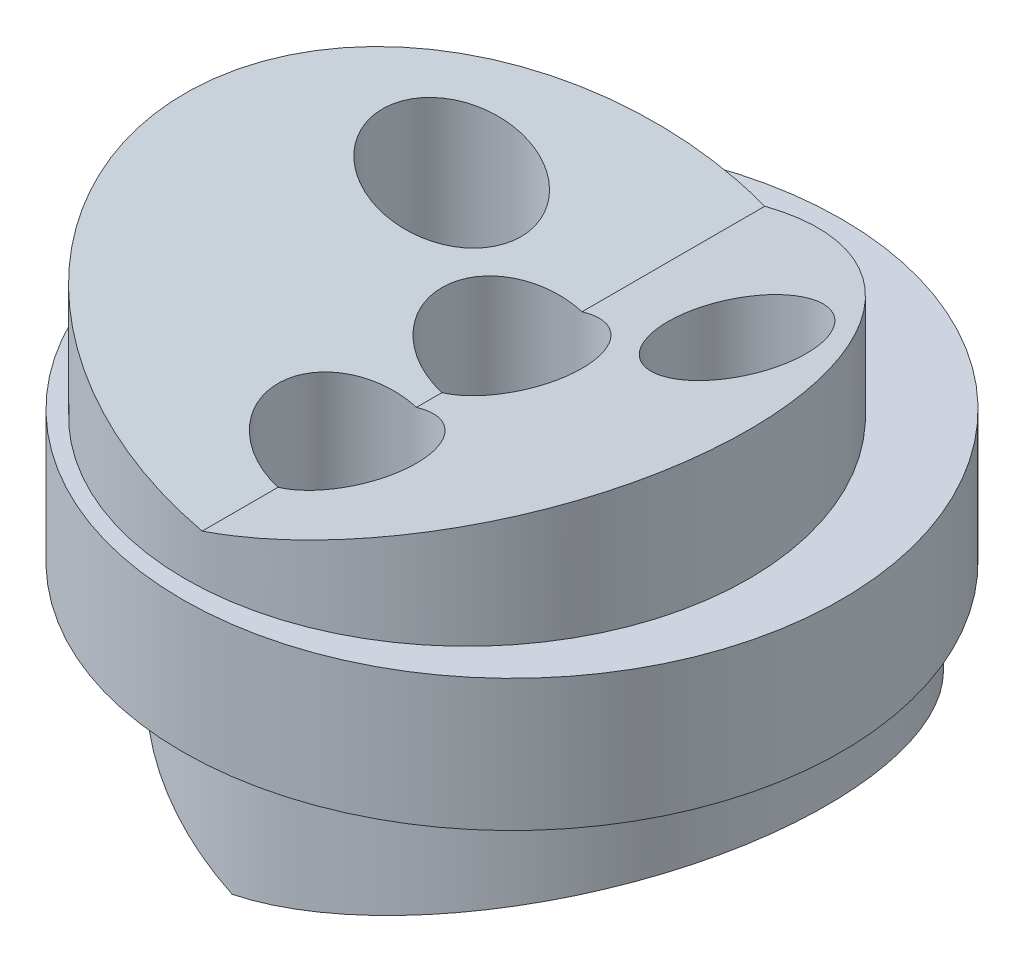
ISO-10303-21;
HEADER;
FILE_DESCRIPTION(('STEP AP214'),'2;1');
FILE_NAME('part.step','',(''),(''),'','','');
FILE_SCHEMA(('AUTOMOTIVE_DESIGN { 1 0 10303 214 1 1 1 1 }'));
ENDSEC;
DATA;
#1=APPLICATION_CONTEXT('core data for automotive mechanical design processes');
#2=APPLICATION_PROTOCOL_DEFINITION('international standard','automotive_design',2000,#1);
#3=PRODUCT_CONTEXT('',#1,'mechanical');
#4=PRODUCT('Part','Part','',(#3));
#5=PRODUCT_RELATED_PRODUCT_CATEGORY('part','',(#4));
#6=PRODUCT_DEFINITION_FORMATION('','',#4);
#7=PRODUCT_DEFINITION_CONTEXT('part definition',#1,'design');
#8=PRODUCT_DEFINITION('design','',#6,#7);
#9=PRODUCT_DEFINITION_SHAPE('','',#8);
#10=(LENGTH_UNIT() NAMED_UNIT(*) SI_UNIT(.MILLI.,.METRE.));
#11=(NAMED_UNIT(*) PLANE_ANGLE_UNIT() SI_UNIT($,.RADIAN.));
#12=(NAMED_UNIT(*) SI_UNIT($,.STERADIAN.) SOLID_ANGLE_UNIT());
#13=UNCERTAINTY_MEASURE_WITH_UNIT(LENGTH_MEASURE(1.E-05),#10,'distance_accuracy_value','');
#14=(GEOMETRIC_REPRESENTATION_CONTEXT(3) GLOBAL_UNCERTAINTY_ASSIGNED_CONTEXT((#13)) GLOBAL_UNIT_ASSIGNED_CONTEXT((#10,
#11,#12)) REPRESENTATION_CONTEXT('',''));
#15=CARTESIAN_POINT('',(0.,0.,0.));
#16=DIRECTION('',(0.,0.,1.));
#17=DIRECTION('',(1.,0.,0.));
#18=AXIS2_PLACEMENT_3D('',#15,#16,#17);
#19=CARTESIAN_POINT('',(-10.,15.4999999999969,-14.01));
#20=DIRECTION('',(-0.287347885566345,-0.957826285221151,0.));
#21=DIRECTION('',(0.957826285221151,-0.287347885566345,0.));
#22=AXIS2_PLACEMENT_3D('',#19,#20,#21);
#23=PLANE('',#22);
#24=CARTESIAN_POINT('',(-4.33012701892218,13.7990381056736,-2.50000000000002));
#25=DIRECTION('',(-0.287347885566345,-0.957826285221151,0.));
#26=DIRECTION('',(0.957826285221151,-0.287347885566345,0.));
#27=AXIS2_PLACEMENT_3D('',#24,#25,#26);
#28=ELLIPSE('',#27,2.19246436687122,2.1);
#29=CARTESIAN_POINT('',(-2.23012701892218,13.1690381056736,-2.50000000000002));
#30=VERTEX_POINT('',#29);
#31=EDGE_CURVE('E117',#30,#30,#28,.T.);
#32=ORIENTED_EDGE('',*,*,#31,.T.);
#33=EDGE_LOOP('',(#32));
#34=FACE_BOUND('',#33,.T.);
#35=DIRECTION('',(0.,0.,1.));
#36=VECTOR('',#35,1.);
#37=CARTESIAN_POINT('',(0.,12.4999999999969,-14.01));
#38=LINE('',#37,#36);
#39=CARTESIAN_POINT('',(0.,12.4999999999969,7.09999999999999));
#40=VERTEX_POINT('',#39);
#41=CARTESIAN_POINT('',(0.,12.4999999999969,9.40139299985199));
#42=VERTEX_POINT('',#41);
#43=EDGE_CURVE('E106',#40,#42,#38,.T.);
#44=ORIENTED_EDGE('',*,*,#43,.F.);
#45=CARTESIAN_POINT('',(0.,12.4999999999969,5.));
#46=DIRECTION('',(-0.287347885566345,-0.957826285221151,0.));
#47=DIRECTION('',(0.957826285221151,-0.287347885566345,0.));
#48=AXIS2_PLACEMENT_3D('',#45,#46,#47);
#49=ELLIPSE('',#48,2.19246436687122,2.1);
#50=CARTESIAN_POINT('',(0.,12.4999999999969,2.89999999999999));
#51=VERTEX_POINT('',#50);
#52=EDGE_CURVE('E94',#40,#51,#49,.T.);
#53=ORIENTED_EDGE('',*,*,#52,.T.);
#54=CARTESIAN_POINT('',(0.,12.4999999999969,2.125));
#55=VERTEX_POINT('',#54);
#56=EDGE_CURVE('E112',#55,#51,#38,.T.);
#57=ORIENTED_EDGE('',*,*,#56,.F.);
#58=CARTESIAN_POINT('',(0.,12.4999999999969,0.));
#59=DIRECTION('',(-0.287347885566345,-0.957826285221151,0.));
#60=DIRECTION('',(0.957826285221151,-0.287347885566345,0.));
#61=AXIS2_PLACEMENT_3D('',#58,#59,#60);
#62=ELLIPSE('',#61,2.21856513314349,2.125);
#63=CARTESIAN_POINT('',(0.,12.4999999999969,-2.125));
#64=VERTEX_POINT('',#63);
#65=EDGE_CURVE('E142',#64,#55,#62,.F.);
#66=ORIENTED_EDGE('',*,*,#65,.F.);
#67=CARTESIAN_POINT('',(0.,12.4999999999969,-7.66934219228312));
#68=VERTEX_POINT('',#67);
#69=EDGE_CURVE('E103',#68,#64,#38,.T.);
#70=ORIENTED_EDGE('',*,*,#69,.F.);
#71=CARTESIAN_POINT('',(-0.500000000000004,12.6499999999969,0.866025403784436));
#72=DIRECTION('',(-0.287347885566345,-0.957826285221151,0.));
#73=DIRECTION('',(0.957826285221151,-0.287347885566345,0.));
#74=AXIS2_PLACEMENT_3D('',#71,#72,#73);
#75=ELLIPSE('',#74,8.92646206511852,8.55);
#76=EDGE_CURVE('E108',#42,#68,#75,.T.);
#77=ORIENTED_EDGE('',*,*,#76,.F.);
#78=EDGE_LOOP('',(#44,#53,#57,#66,#70,#77));
#79=FACE_BOUND('',#78,.T.);
#80=ADVANCED_FACE('F41',(#34,#79),#23,.F.);
#81=CARTESIAN_POINT('',(10.,15.4999999999969,-14.01));
#82=DIRECTION('',(0.287347885566345,-0.957826285221151,0.));
#83=DIRECTION('',(0.957826285221151,0.287347885566345,0.));
#84=AXIS2_PLACEMENT_3D('',#81,#82,#83);
#85=PLANE('',#84);
#86=CARTESIAN_POINT('',(4.33012701892218,13.7990381056736,-2.50000000000002));
#87=DIRECTION('',(0.287347885566345,-0.957826285221151,0.));
#88=DIRECTION('',(-0.957826285221151,-0.287347885566345,0.));
#89=AXIS2_PLACEMENT_3D('',#86,#87,#88);
#90=ELLIPSE('',#89,2.19246436687122,2.1);
#91=CARTESIAN_POINT('',(2.23012701892218,13.1690381056736,-2.50000000000002));
#92=VERTEX_POINT('',#91);
#93=EDGE_CURVE('E120',#92,#92,#90,.T.);
#94=ORIENTED_EDGE('',*,*,#93,.T.);
#95=EDGE_LOOP('',(#94));
#96=FACE_BOUND('',#95,.T.);
#97=ORIENTED_EDGE('',*,*,#69,.T.);
#98=CARTESIAN_POINT('',(0.,12.4999999999969,0.));
#99=DIRECTION('',(0.287347885566345,-0.957826285221151,0.));
#100=DIRECTION('',(-0.957826285221151,-0.287347885566345,0.));
#101=AXIS2_PLACEMENT_3D('',#98,#99,#100);
#102=ELLIPSE('',#101,2.21856513314349,2.125);
#103=EDGE_CURVE('E139',#55,#64,#102,.F.);
#104=ORIENTED_EDGE('',*,*,#103,.F.);
#105=ORIENTED_EDGE('',*,*,#56,.T.);
#106=CARTESIAN_POINT('',(0.,12.4999999999969,5.));
#107=DIRECTION('',(0.287347885566345,-0.957826285221151,0.));
#108=DIRECTION('',(-0.957826285221151,-0.287347885566345,0.));
#109=AXIS2_PLACEMENT_3D('',#106,#107,#108);
#110=ELLIPSE('',#109,2.19246436687122,2.1);
#111=EDGE_CURVE('E99',#51,#40,#110,.T.);
#112=ORIENTED_EDGE('',*,*,#111,.T.);
#113=ORIENTED_EDGE('',*,*,#43,.T.);
#114=CARTESIAN_POINT('',(-0.500000000000004,12.3499999999969,0.866025403784436));
#115=DIRECTION('',(0.287347885566345,-0.957826285221151,0.));
#116=DIRECTION('',(-0.957826285221151,-0.287347885566345,0.));
#117=AXIS2_PLACEMENT_3D('',#114,#115,#116);
#118=ELLIPSE('',#117,8.92646206511852,8.55);
#119=EDGE_CURVE('E126',#68,#42,#118,.T.);
#120=ORIENTED_EDGE('',*,*,#119,.F.);
#121=EDGE_LOOP('',(#97,#104,#105,#112,#113,#120));
#122=FACE_BOUND('',#121,.T.);
#123=ADVANCED_FACE('F115',(#96,#122),#85,.F.);
#124=CARTESIAN_POINT('',(-10.,5.49999999999693,-14.01));
#125=DIRECTION('',(-0.287347885566345,-0.957826285221151,0.));
#126=DIRECTION('',(0.957826285221151,-0.287347885566345,0.));
#127=AXIS2_PLACEMENT_3D('',#124,#125,#126);
#128=PLANE('',#127);
#129=DIRECTION('',(0.,0.,1.));
#130=VECTOR('',#129,1.);
#131=CARTESIAN_POINT('',(0.,2.49999999999693,-14.01));
#132=LINE('',#131,#130);
#133=CARTESIAN_POINT('',(0.,2.49999999999693,7.09999999999999));
#134=VERTEX_POINT('',#133);
#135=CARTESIAN_POINT('',(0.,2.49999999999693,8.49131909658328));
#136=VERTEX_POINT('',#135);
#137=EDGE_CURVE('E11',#134,#136,#132,.T.);
#138=ORIENTED_EDGE('',*,*,#137,.T.);
#139=CARTESIAN_POINT('',(1.,2.19999999999693,0.));
#140=DIRECTION('',(-0.287347885566345,-0.957826285221151,0.));
#141=DIRECTION('',(0.957826285221151,-0.287347885566345,0.));
#142=AXIS2_PLACEMENT_3D('',#139,#140,#141);
#143=ELLIPSE('',#142,8.92646206511852,8.55);
#144=CARTESIAN_POINT('',(0.,2.49999999999693,-8.49131909658329));
#145=VERTEX_POINT('',#144);
#146=EDGE_CURVE('E127',#136,#145,#143,.T.);
#147=ORIENTED_EDGE('',*,*,#146,.T.);
#148=CARTESIAN_POINT('',(0.,2.49999999999693,-2.125));
#149=VERTEX_POINT('',#148);
#150=EDGE_CURVE('E52',#145,#149,#132,.T.);
#151=ORIENTED_EDGE('',*,*,#150,.T.);
#152=CARTESIAN_POINT('',(0.,2.49999999999693,0.));
#153=DIRECTION('',(-0.287347885566345,-0.957826285221151,0.));
#154=DIRECTION('',(0.957826285221151,-0.287347885566345,0.));
#155=AXIS2_PLACEMENT_3D('',#152,#153,#154);
#156=ELLIPSE('',#155,2.21856513314349,2.125);
#157=CARTESIAN_POINT('',(0.,2.49999999999693,2.125));
#158=VERTEX_POINT('',#157);
#159=EDGE_CURVE('E45',#149,#158,#156,.F.);
#160=ORIENTED_EDGE('',*,*,#159,.T.);
#161=CARTESIAN_POINT('',(0.,2.49999999999693,2.89999999999999));
#162=VERTEX_POINT('',#161);
#163=EDGE_CURVE('E50',#158,#162,#132,.T.);
#164=ORIENTED_EDGE('',*,*,#163,.T.);
#165=CARTESIAN_POINT('',(0.,2.49999999999693,5.));
#166=DIRECTION('',(-0.287347885566345,-0.957826285221151,0.));
#167=DIRECTION('',(0.957826285221151,-0.287347885566345,0.));
#168=AXIS2_PLACEMENT_3D('',#165,#166,#167);
#169=ELLIPSE('',#168,2.19246436687122,2.1);
#170=EDGE_CURVE('E157',#134,#162,#169,.T.);
#171=ORIENTED_EDGE('',*,*,#170,.F.);
#172=EDGE_LOOP('',(#138,#147,#151,#160,#164,#171));
#173=FACE_BOUND('',#172,.T.);
#174=CARTESIAN_POINT('',(-4.33012701892218,3.79903810567358,-2.50000000000002));
#175=DIRECTION('',(-0.287347885566345,-0.957826285221151,0.));
#176=DIRECTION('',(0.957826285221151,-0.287347885566345,0.));
#177=AXIS2_PLACEMENT_3D('',#174,#175,#176);
#178=ELLIPSE('',#177,2.19246436687122,2.1);
#179=CARTESIAN_POINT('',(-2.23012701892218,3.16903810567358,-2.50000000000002));
#180=VERTEX_POINT('',#179);
#181=EDGE_CURVE('E161',#180,#180,#178,.T.);
#182=ORIENTED_EDGE('',*,*,#181,.F.);
#183=EDGE_LOOP('',(#182));
#184=FACE_BOUND('',#183,.T.);
#185=ADVANCED_FACE('F172',(#173,#184),#128,.T.);
#186=CARTESIAN_POINT('',(10.,5.49999999999693,-14.01));
#187=DIRECTION('',(0.287347885566345,-0.957826285221151,0.));
#188=DIRECTION('',(0.957826285221151,0.287347885566345,0.));
#189=AXIS2_PLACEMENT_3D('',#186,#187,#188);
#190=PLANE('',#189);
#191=ORIENTED_EDGE('',*,*,#150,.F.);
#192=CARTESIAN_POINT('',(1.,2.79999999999693,0.));
#193=DIRECTION('',(0.287347885566345,-0.957826285221151,0.));
#194=DIRECTION('',(-0.957826285221151,-0.287347885566345,0.));
#195=AXIS2_PLACEMENT_3D('',#192,#193,#194);
#196=ELLIPSE('',#195,8.92646206511852,8.55);
#197=EDGE_CURVE('E124',#145,#136,#196,.T.);
#198=ORIENTED_EDGE('',*,*,#197,.T.);
#199=ORIENTED_EDGE('',*,*,#137,.F.);
#200=CARTESIAN_POINT('',(0.,2.49999999999692,5.));
#201=DIRECTION('',(0.287347885566345,-0.957826285221151,0.));
#202=DIRECTION('',(-0.957826285221151,-0.287347885566345,0.));
#203=AXIS2_PLACEMENT_3D('',#200,#201,#202);
#204=ELLIPSE('',#203,2.19246436687122,2.1);
#205=EDGE_CURVE('E159',#162,#134,#204,.T.);
#206=ORIENTED_EDGE('',*,*,#205,.F.);
#207=ORIENTED_EDGE('',*,*,#163,.F.);
#208=CARTESIAN_POINT('',(0.,2.49999999999692,0.));
#209=DIRECTION('',(0.287347885566345,-0.957826285221151,0.));
#210=DIRECTION('',(-0.957826285221151,-0.287347885566345,0.));
#211=AXIS2_PLACEMENT_3D('',#208,#209,#210);
#212=ELLIPSE('',#211,2.21856513314349,2.125);
#213=EDGE_CURVE('E129',#158,#149,#212,.F.);
#214=ORIENTED_EDGE('',*,*,#213,.T.);
#215=EDGE_LOOP('',(#191,#198,#199,#206,#207,#214));
#216=FACE_BOUND('',#215,.T.);
#217=CARTESIAN_POINT('',(4.33012701892218,3.79903810567358,-2.50000000000002));
#218=DIRECTION('',(0.287347885566345,-0.957826285221151,0.));
#219=DIRECTION('',(-0.957826285221151,-0.287347885566345,0.));
#220=AXIS2_PLACEMENT_3D('',#217,#218,#219);
#221=ELLIPSE('',#220,2.19246436687122,2.1);
#222=CARTESIAN_POINT('',(2.23012701892218,3.16903810567358,-2.50000000000002));
#223=VERTEX_POINT('',#222);
#224=EDGE_CURVE('E144',#223,#223,#221,.T.);
#225=ORIENTED_EDGE('',*,*,#224,.F.);
#226=EDGE_LOOP('',(#225));
#227=FACE_BOUND('',#226,.T.);
#228=ADVANCED_FACE('F170',(#216,#227),#190,.T.);
#229=CARTESIAN_POINT('',(0.,31.5,5.));
#230=DIRECTION('',(0.,-1.,0.));
#231=DIRECTION('',(0.,0.,-1.));
#232=AXIS2_PLACEMENT_3D('',#229,#230,#231);
#233=CYLINDRICAL_SURFACE('',#232,2.1);
#234=ORIENTED_EDGE('',*,*,#111,.F.);
#235=ORIENTED_EDGE('',*,*,#52,.F.);
#236=EDGE_LOOP('',(#234,#235));
#237=FACE_BOUND('',#236,.T.);
#238=ORIENTED_EDGE('',*,*,#170,.T.);
#239=ORIENTED_EDGE('',*,*,#205,.T.);
#240=EDGE_LOOP('',(#238,#239));
#241=FACE_BOUND('',#240,.T.);
#242=ADVANCED_FACE('F96',(#237,#241),#233,.F.);
#243=CARTESIAN_POINT('',(-4.33012701892218,31.5,-2.50000000000002));
#244=DIRECTION('',(0.,-1.,0.));
#245=DIRECTION('',(0.,0.,-1.));
#246=AXIS2_PLACEMENT_3D('',#243,#244,#245);
#247=CYLINDRICAL_SURFACE('',#246,2.1);
#248=ORIENTED_EDGE('',*,*,#31,.F.);
#249=EDGE_LOOP('',(#248));
#250=FACE_BOUND('',#249,.T.);
#251=ORIENTED_EDGE('',*,*,#181,.T.);
#252=EDGE_LOOP('',(#251));
#253=FACE_BOUND('',#252,.T.);
#254=ADVANCED_FACE('F179',(#250,#253),#247,.F.);
#255=CARTESIAN_POINT('',(4.33012701892218,31.5,-2.50000000000002));
#256=DIRECTION('',(0.,-1.,0.));
#257=DIRECTION('',(0.,0.,-1.));
#258=AXIS2_PLACEMENT_3D('',#255,#256,#257);
#259=CYLINDRICAL_SURFACE('',#258,2.1);
#260=ORIENTED_EDGE('',*,*,#93,.F.);
#261=EDGE_LOOP('',(#260));
#262=FACE_BOUND('',#261,.T.);
#263=ORIENTED_EDGE('',*,*,#224,.T.);
#264=EDGE_LOOP('',(#263));
#265=FACE_BOUND('',#264,.T.);
#266=ADVANCED_FACE('F168',(#262,#265),#259,.F.);
#267=CARTESIAN_POINT('',(0.,30.75,0.));
#268=DIRECTION('',(0.,-1.,0.));
#269=DIRECTION('',(0.,0.,-1.));
#270=AXIS2_PLACEMENT_3D('',#267,#268,#269);
#271=CYLINDRICAL_SURFACE('',#270,2.125);
#272=ORIENTED_EDGE('',*,*,#65,.T.);
#273=ORIENTED_EDGE('',*,*,#103,.T.);
#274=EDGE_LOOP('',(#272,#273));
#275=FACE_BOUND('',#274,.T.);
#276=ORIENTED_EDGE('',*,*,#213,.F.);
#277=ORIENTED_EDGE('',*,*,#159,.F.);
#278=EDGE_LOOP('',(#276,#277));
#279=FACE_BOUND('',#278,.T.);
#280=ADVANCED_FACE('F198',(#275,#279),#271,.F.);
#281=CARTESIAN_POINT('',(0.,39.2842712474619,0.));
#282=DIRECTION('',(0.,-1.,0.));
#283=DIRECTION('',(0.,0.,-1.));
#284=AXIS2_PLACEMENT_3D('',#281,#282,#283);
#285=CYLINDRICAL_SURFACE('',#284,10.);
#286=CARTESIAN_POINT('',(0.,7.,0.));
#287=DIRECTION('',(0.,1.,0.));
#288=DIRECTION('',(0.,0.,1.));
#289=AXIS2_PLACEMENT_3D('',#286,#287,#288);
#290=CIRCLE('',#289,10.);
#291=CARTESIAN_POINT('',(0.,7.,10.));
#292=VERTEX_POINT('',#291);
#293=EDGE_CURVE('E145',#292,#292,#290,.T.);
#294=ORIENTED_EDGE('',*,*,#293,.T.);
#295=EDGE_LOOP('',(#294));
#296=FACE_BOUND('',#295,.T.);
#297=CARTESIAN_POINT('',(0.,11.,0.));
#298=DIRECTION('',(0.,1.,0.));
#299=DIRECTION('',(0.,0.,1.));
#300=AXIS2_PLACEMENT_3D('',#297,#298,#299);
#301=CIRCLE('',#300,10.);
#302=CARTESIAN_POINT('',(0.,11.,10.));
#303=VERTEX_POINT('',#302);
#304=EDGE_CURVE('E148',#303,#303,#301,.T.);
#305=ORIENTED_EDGE('',*,*,#304,.F.);
#306=EDGE_LOOP('',(#305));
#307=FACE_BOUND('',#306,.T.);
#308=ADVANCED_FACE('F194',(#296,#307),#285,.T.);
#309=CARTESIAN_POINT('',(0.499999999999998,7.,0.));
#310=DIRECTION('',(0.,1.,0.));
#311=DIRECTION('',(0.,0.,1.));
#312=AXIS2_PLACEMENT_3D('',#309,#310,#311);
#313=PLANE('',#312);
#314=CARTESIAN_POINT('',(1.,7.,0.));
#315=DIRECTION('',(0.,1.,0.));
#316=DIRECTION('',(0.,0.,1.));
#317=AXIS2_PLACEMENT_3D('',#314,#315,#316);
#318=CIRCLE('',#317,8.55);
#319=CARTESIAN_POINT('',(1.,7.,8.55));
#320=VERTEX_POINT('',#319);
#321=EDGE_CURVE('E154',#320,#320,#318,.T.);
#322=ORIENTED_EDGE('',*,*,#321,.T.);
#323=EDGE_LOOP('',(#322));
#324=FACE_BOUND('',#323,.T.);
#325=ORIENTED_EDGE('',*,*,#293,.F.);
#326=EDGE_LOOP('',(#325));
#327=FACE_BOUND('',#326,.T.);
#328=ADVANCED_FACE('F197',(#324,#327),#313,.F.);
#329=CARTESIAN_POINT('',(1.,7.,0.));
#330=DIRECTION('',(0.,-1.,0.));
#331=DIRECTION('',(0.,0.,-1.));
#332=AXIS2_PLACEMENT_3D('',#329,#330,#331);
#333=CYLINDRICAL_SURFACE('',#332,8.55);
#334=ORIENTED_EDGE('',*,*,#321,.F.);
#335=EDGE_LOOP('',(#334));
#336=FACE_BOUND('',#335,.T.);
#337=ORIENTED_EDGE('',*,*,#197,.F.);
#338=ORIENTED_EDGE('',*,*,#146,.F.);
#339=EDGE_LOOP('',(#337,#338));
#340=FACE_BOUND('',#339,.T.);
#341=ADVANCED_FACE('F43',(#336,#340),#333,.T.);
#342=CARTESIAN_POINT('',(0.249999999999996,11.,0.433012701892218));
#343=DIRECTION('',(0.,1.,0.));
#344=DIRECTION('',(0.,0.,1.));
#345=AXIS2_PLACEMENT_3D('',#342,#343,#344);
#346=PLANE('',#345);
#347=CARTESIAN_POINT('',(-0.500000000000004,11.,0.866025403784436));
#348=DIRECTION('',(0.,1.,0.));
#349=DIRECTION('',(0.,0.,1.));
#350=AXIS2_PLACEMENT_3D('',#347,#348,#349);
#351=CIRCLE('',#350,8.55);
#352=CARTESIAN_POINT('',(-0.500000000000004,11.,9.41602540378444));
#353=VERTEX_POINT('',#352);
#354=EDGE_CURVE('E151',#353,#353,#351,.T.);
#355=ORIENTED_EDGE('',*,*,#354,.F.);
#356=EDGE_LOOP('',(#355));
#357=FACE_BOUND('',#356,.T.);
#358=ORIENTED_EDGE('',*,*,#304,.T.);
#359=EDGE_LOOP('',(#358));
#360=FACE_BOUND('',#359,.T.);
#361=ADVANCED_FACE('F183',(#357,#360),#346,.T.);
#362=CARTESIAN_POINT('',(-0.500000000000004,18.,0.866025403784436));
#363=DIRECTION('',(0.,-1.,0.));
#364=DIRECTION('',(0.,0.,-1.));
#365=AXIS2_PLACEMENT_3D('',#362,#363,#364);
#366=CYLINDRICAL_SURFACE('',#365,8.55);
#367=ORIENTED_EDGE('',*,*,#76,.T.);
#368=ORIENTED_EDGE('',*,*,#119,.T.);
#369=EDGE_LOOP('',(#367,#368));
#370=FACE_BOUND('',#369,.T.);
#371=ORIENTED_EDGE('',*,*,#354,.T.);
#372=EDGE_LOOP('',(#371));
#373=FACE_BOUND('',#372,.T.);
#374=ADVANCED_FACE('F174',(#370,#373),#366,.T.);
#375=CLOSED_SHELL('',(#80,#123,#185,#228,#242,#254,#266,#280,#308,#328,#341,#361,#374));
#376=MANIFOLD_SOLID_BREP('B2',#375);
#377=ADVANCED_BREP_SHAPE_REPRESENTATION('',(#18,#376),#14);
#378=SHAPE_DEFINITION_REPRESENTATION(#9,#377);
ENDSEC;
END-ISO-10303-21;
